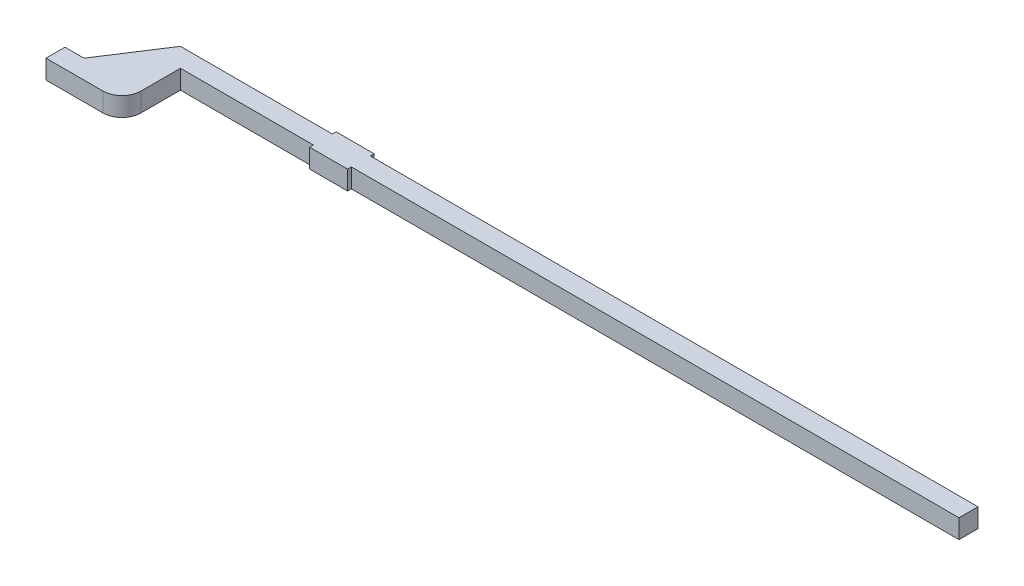
ISO-10303-21;
HEADER;
FILE_DESCRIPTION(('STEP AP214'),'2;1');
FILE_NAME('part.step','',(''),(''),'','','');
FILE_SCHEMA(('AUTOMOTIVE_DESIGN { 1 0 10303 214 1 1 1 1 }'));
ENDSEC;
DATA;
#1=APPLICATION_CONTEXT('core data for automotive mechanical design processes');
#2=APPLICATION_PROTOCOL_DEFINITION('international standard','automotive_design',2000,#1);
#3=PRODUCT_CONTEXT('',#1,'mechanical');
#4=PRODUCT('Part','Part','',(#3));
#5=PRODUCT_RELATED_PRODUCT_CATEGORY('part','',(#4));
#6=PRODUCT_DEFINITION_FORMATION('','',#4);
#7=PRODUCT_DEFINITION_CONTEXT('part definition',#1,'design');
#8=PRODUCT_DEFINITION('design','',#6,#7);
#9=PRODUCT_DEFINITION_SHAPE('','',#8);
#10=(LENGTH_UNIT() NAMED_UNIT(*) SI_UNIT(.MILLI.,.METRE.));
#11=(NAMED_UNIT(*) PLANE_ANGLE_UNIT() SI_UNIT($,.RADIAN.));
#12=(NAMED_UNIT(*) SI_UNIT($,.STERADIAN.) SOLID_ANGLE_UNIT());
#13=UNCERTAINTY_MEASURE_WITH_UNIT(LENGTH_MEASURE(1.E-05),#10,'distance_accuracy_value','');
#14=(GEOMETRIC_REPRESENTATION_CONTEXT(3) GLOBAL_UNCERTAINTY_ASSIGNED_CONTEXT((#13)) GLOBAL_UNIT_ASSIGNED_CONTEXT((#10,
#11,#12)) REPRESENTATION_CONTEXT('',''));
#15=CARTESIAN_POINT('',(0.,0.,0.));
#16=DIRECTION('',(0.,0.,1.));
#17=DIRECTION('',(1.,0.,0.));
#18=AXIS2_PLACEMENT_3D('',#15,#16,#17);
#19=CARTESIAN_POINT('',(0.,0.,0.));
#20=DIRECTION('',(0.,1.,0.));
#21=DIRECTION('',(1.,0.,0.));
#22=AXIS2_PLACEMENT_3D('',#19,#20,#21);
#23=PLANE('',#22);
#24=DIRECTION('',(-1.,0.,0.));
#25=VECTOR('',#24,1.);
#26=CARTESIAN_POINT('',(22.5,0.,-2.04));
#27=LINE('',#26,#25);
#28=CARTESIAN_POINT('',(22.5,0.,-2.04));
#29=VERTEX_POINT('',#28);
#30=CARTESIAN_POINT('',(6.5,0.,-2.04));
#31=VERTEX_POINT('',#30);
#32=EDGE_CURVE('E173',#29,#31,#27,.T.);
#33=ORIENTED_EDGE('',*,*,#32,.F.);
#34=DIRECTION('',(0.,0.,-1.));
#35=VECTOR('',#34,1.);
#36=CARTESIAN_POINT('',(22.5,0.,-1.54));
#37=LINE('',#36,#35);
#38=CARTESIAN_POINT('',(22.5,0.,-1.54));
#39=VERTEX_POINT('',#38);
#40=EDGE_CURVE('E159',#39,#29,#37,.T.);
#41=ORIENTED_EDGE('',*,*,#40,.F.);
#42=DIRECTION('',(1.,0.,0.));
#43=VECTOR('',#42,1.);
#44=CARTESIAN_POINT('',(6.5,0.,-1.54));
#45=LINE('',#44,#43);
#46=CARTESIAN_POINT('',(6.5,0.,-1.54));
#47=VERTEX_POINT('',#46);
#48=EDGE_CURVE('E171',#47,#39,#45,.T.);
#49=ORIENTED_EDGE('',*,*,#48,.F.);
#50=DIRECTION('',(0.,0.,-1.));
#51=VECTOR('',#50,1.);
#52=CARTESIAN_POINT('',(6.5,0.,-1.44));
#53=LINE('',#52,#51);
#54=CARTESIAN_POINT('',(6.5,0.,-1.44));
#55=VERTEX_POINT('',#54);
#56=EDGE_CURVE('E264',#55,#47,#53,.T.);
#57=ORIENTED_EDGE('',*,*,#56,.F.);
#58=DIRECTION('',(1.,0.,0.));
#59=VECTOR('',#58,1.);
#60=CARTESIAN_POINT('',(5.5,0.,-1.44));
#61=LINE('',#60,#59);
#62=CARTESIAN_POINT('',(5.5,0.,-1.44));
#63=VERTEX_POINT('',#62);
#64=EDGE_CURVE('E252',#63,#55,#61,.T.);
#65=ORIENTED_EDGE('',*,*,#64,.F.);
#66=DIRECTION('',(0.,0.,1.));
#67=VECTOR('',#66,1.);
#68=CARTESIAN_POINT('',(5.5,0.,-1.54));
#69=LINE('',#68,#67);
#70=CARTESIAN_POINT('',(5.5,0.,-1.54));
#71=VERTEX_POINT('',#70);
#72=EDGE_CURVE('E194',#71,#63,#69,.T.);
#73=ORIENTED_EDGE('',*,*,#72,.F.);
#74=DIRECTION('',(1.,0.,0.));
#75=VECTOR('',#74,1.);
#76=CARTESIAN_POINT('',(2.,0.,-1.54));
#77=LINE('',#76,#75);
#78=CARTESIAN_POINT('',(2.,0.,-1.54));
#79=VERTEX_POINT('',#78);
#80=EDGE_CURVE('E132',#79,#71,#77,.T.);
#81=ORIENTED_EDGE('',*,*,#80,.F.);
#82=DIRECTION('',(0.,0.,-1.));
#83=VECTOR('',#82,1.);
#84=CARTESIAN_POINT('',(2.,0.,-0.5));
#85=LINE('',#84,#83);
#86=CARTESIAN_POINT('',(2.,0.,-0.5));
#87=VERTEX_POINT('',#86);
#88=EDGE_CURVE('E129',#87,#79,#85,.T.);
#89=ORIENTED_EDGE('',*,*,#88,.F.);
#90=CARTESIAN_POINT('',(1.5,0.,-0.5));
#91=DIRECTION('',(0.,1.,0.));
#92=DIRECTION('',(0.,0.,1.));
#93=AXIS2_PLACEMENT_3D('',#90,#91,#92);
#94=CIRCLE('',#93,0.5);
#95=CARTESIAN_POINT('',(1.5,0.,0.));
#96=VERTEX_POINT('',#95);
#97=EDGE_CURVE('E115',#96,#87,#94,.T.);
#98=ORIENTED_EDGE('',*,*,#97,.F.);
#99=DIRECTION('',(1.,0.,0.));
#100=VECTOR('',#99,1.);
#101=CARTESIAN_POINT('',(0.,0.,0.));
#102=LINE('',#101,#100);
#103=CARTESIAN_POINT('',(0.,0.,0.));
#104=VERTEX_POINT('',#103);
#105=EDGE_CURVE('E221',#104,#96,#102,.T.);
#106=ORIENTED_EDGE('',*,*,#105,.F.);
#107=DIRECTION('',(0.,0.,1.));
#108=VECTOR('',#107,1.);
#109=CARTESIAN_POINT('',(0.,0.,-0.5));
#110=LINE('',#109,#108);
#111=CARTESIAN_POINT('',(0.,0.,-0.5));
#112=VERTEX_POINT('',#111);
#113=EDGE_CURVE('E214',#112,#104,#110,.T.);
#114=ORIENTED_EDGE('',*,*,#113,.F.);
#115=DIRECTION('',(-1.,0.,0.));
#116=VECTOR('',#115,1.);
#117=CARTESIAN_POINT('',(0.5,0.,-0.5));
#118=LINE('',#117,#116);
#119=CARTESIAN_POINT('',(0.5,0.,-0.5));
#120=VERTEX_POINT('',#119);
#121=EDGE_CURVE('E213',#120,#112,#118,.T.);
#122=ORIENTED_EDGE('',*,*,#121,.F.);
#123=DIRECTION('',(-0.544605442853032,0.,0.83869238199405));
#124=VECTOR('',#123,1.);
#125=CARTESIAN_POINT('',(1.5,0.,-2.04));
#126=LINE('',#125,#124);
#127=CARTESIAN_POINT('',(1.5,0.,-2.04));
#128=VERTEX_POINT('',#127);
#129=EDGE_CURVE('E315',#128,#120,#126,.T.);
#130=ORIENTED_EDGE('',*,*,#129,.F.);
#131=DIRECTION('',(-1.,0.,0.));
#132=VECTOR('',#131,1.);
#133=CARTESIAN_POINT('',(5.5,0.,-2.04));
#134=LINE('',#133,#132);
#135=CARTESIAN_POINT('',(5.5,0.,-2.04));
#136=VERTEX_POINT('',#135);
#137=EDGE_CURVE('E200',#136,#128,#134,.T.);
#138=ORIENTED_EDGE('',*,*,#137,.F.);
#139=DIRECTION('',(0.,0.,1.));
#140=VECTOR('',#139,1.);
#141=CARTESIAN_POINT('',(5.5,0.,-2.14));
#142=LINE('',#141,#140);
#143=CARTESIAN_POINT('',(5.5,0.,-2.14));
#144=VERTEX_POINT('',#143);
#145=EDGE_CURVE('E27',#144,#136,#142,.T.);
#146=ORIENTED_EDGE('',*,*,#145,.F.);
#147=DIRECTION('',(-1.,0.,0.));
#148=VECTOR('',#147,1.);
#149=CARTESIAN_POINT('',(6.5,0.,-2.14));
#150=LINE('',#149,#148);
#151=CARTESIAN_POINT('',(6.5,0.,-2.14));
#152=VERTEX_POINT('',#151);
#153=EDGE_CURVE('E11',#152,#144,#150,.T.);
#154=ORIENTED_EDGE('',*,*,#153,.F.);
#155=DIRECTION('',(0.,0.,-1.));
#156=VECTOR('',#155,1.);
#157=CARTESIAN_POINT('',(6.5,0.,0.));
#158=LINE('',#157,#156);
#159=EDGE_CURVE('E287',#31,#152,#158,.T.);
#160=ORIENTED_EDGE('',*,*,#159,.F.);
#161=EDGE_LOOP('',(#33,#41,#49,#57,#65,#73,#81,#89,#98,#106,#114,#122,#130,#138,#146,#154,#160));
#162=FACE_BOUND('',#161,.T.);
#163=ADVANCED_FACE('F16',(#162),#23,.F.);
#164=CARTESIAN_POINT('',(6.5,0.,-2.14));
#165=DIRECTION('',(0.,0.,-1.));
#166=DIRECTION('',(0.,-1.,0.));
#167=AXIS2_PLACEMENT_3D('',#164,#165,#166);
#168=PLANE('',#167);
#169=DIRECTION('',(-1.,0.,0.));
#170=VECTOR('',#169,1.);
#171=CARTESIAN_POINT('',(0.,0.5,-2.14));
#172=LINE('',#171,#170);
#173=CARTESIAN_POINT('',(6.5,0.5,-2.14));
#174=VERTEX_POINT('',#173);
#175=CARTESIAN_POINT('',(5.5,0.5,-2.14));
#176=VERTEX_POINT('',#175);
#177=EDGE_CURVE('E219',#174,#176,#172,.T.);
#178=ORIENTED_EDGE('',*,*,#177,.F.);
#179=DIRECTION('',(0.,1.,0.));
#180=VECTOR('',#179,1.);
#181=CARTESIAN_POINT('',(6.5,0.,-2.14));
#182=LINE('',#181,#180);
#183=EDGE_CURVE('E188',#152,#174,#182,.T.);
#184=ORIENTED_EDGE('',*,*,#183,.F.);
#185=ORIENTED_EDGE('',*,*,#153,.T.);
#186=DIRECTION('',(0.,-1.,0.));
#187=VECTOR('',#186,1.);
#188=CARTESIAN_POINT('',(5.5,0.,-2.14));
#189=LINE('',#188,#187);
#190=EDGE_CURVE('E196',#176,#144,#189,.T.);
#191=ORIENTED_EDGE('',*,*,#190,.F.);
#192=EDGE_LOOP('',(#178,#184,#185,#191));
#193=FACE_BOUND('',#192,.T.);
#194=ADVANCED_FACE('F527',(#193),#168,.T.);
#195=CARTESIAN_POINT('',(5.5,0.,-2.14));
#196=DIRECTION('',(-1.,0.,0.));
#197=DIRECTION('',(0.,0.,1.));
#198=AXIS2_PLACEMENT_3D('',#195,#196,#197);
#199=PLANE('',#198);
#200=DIRECTION('',(0.,0.,1.));
#201=VECTOR('',#200,1.);
#202=CARTESIAN_POINT('',(5.5,0.5,0.));
#203=LINE('',#202,#201);
#204=CARTESIAN_POINT('',(5.5,0.5,-2.04));
#205=VERTEX_POINT('',#204);
#206=EDGE_CURVE('E273',#176,#205,#203,.T.);
#207=ORIENTED_EDGE('',*,*,#206,.F.);
#208=ORIENTED_EDGE('',*,*,#190,.T.);
#209=ORIENTED_EDGE('',*,*,#145,.T.);
#210=DIRECTION('',(0.,-1.,0.));
#211=VECTOR('',#210,1.);
#212=CARTESIAN_POINT('',(5.5,0.,-2.04));
#213=LINE('',#212,#211);
#214=EDGE_CURVE('E256',#205,#136,#213,.T.);
#215=ORIENTED_EDGE('',*,*,#214,.F.);
#216=EDGE_LOOP('',(#207,#208,#209,#215));
#217=FACE_BOUND('',#216,.T.);
#218=ADVANCED_FACE('F518',(#217),#199,.T.);
#219=CARTESIAN_POINT('',(5.5,0.,-2.04));
#220=DIRECTION('',(0.,0.,-1.));
#221=DIRECTION('',(0.,-1.,0.));
#222=AXIS2_PLACEMENT_3D('',#219,#220,#221);
#223=PLANE('',#222);
#224=DIRECTION('',(-1.,0.,0.));
#225=VECTOR('',#224,1.);
#226=CARTESIAN_POINT('',(0.,0.5,-2.04));
#227=LINE('',#226,#225);
#228=CARTESIAN_POINT('',(1.5,0.5,-2.04));
#229=VERTEX_POINT('',#228);
#230=EDGE_CURVE('E320',#205,#229,#227,.T.);
#231=ORIENTED_EDGE('',*,*,#230,.F.);
#232=ORIENTED_EDGE('',*,*,#214,.T.);
#233=ORIENTED_EDGE('',*,*,#137,.T.);
#234=DIRECTION('',(0.,-1.,0.));
#235=VECTOR('',#234,1.);
#236=CARTESIAN_POINT('',(1.5,0.,-2.04));
#237=LINE('',#236,#235);
#238=EDGE_CURVE('E328',#229,#128,#237,.T.);
#239=ORIENTED_EDGE('',*,*,#238,.F.);
#240=EDGE_LOOP('',(#231,#232,#233,#239));
#241=FACE_BOUND('',#240,.T.);
#242=ADVANCED_FACE('F353',(#241),#223,.T.);
#243=CARTESIAN_POINT('',(1.5,0.,-2.04));
#244=DIRECTION('',(-0.83869238199405,0.,-0.544605442853032));
#245=DIRECTION('',(-0.544605442853032,0.,0.83869238199405));
#246=AXIS2_PLACEMENT_3D('',#243,#244,#245);
#247=PLANE('',#246);
#248=DIRECTION('',(-0.544605442853032,0.,0.83869238199405));
#249=VECTOR('',#248,1.);
#250=CARTESIAN_POINT('',(1.5,0.5,-2.04));
#251=LINE('',#250,#249);
#252=CARTESIAN_POINT('',(0.5,0.5,-0.5));
#253=VERTEX_POINT('',#252);
#254=EDGE_CURVE('E316',#229,#253,#251,.T.);
#255=ORIENTED_EDGE('',*,*,#254,.F.);
#256=ORIENTED_EDGE('',*,*,#238,.T.);
#257=ORIENTED_EDGE('',*,*,#129,.T.);
#258=DIRECTION('',(0.,-1.,0.));
#259=VECTOR('',#258,1.);
#260=CARTESIAN_POINT('',(0.5,0.,-0.5));
#261=LINE('',#260,#259);
#262=EDGE_CURVE('E209',#253,#120,#261,.T.);
#263=ORIENTED_EDGE('',*,*,#262,.F.);
#264=EDGE_LOOP('',(#255,#256,#257,#263));
#265=FACE_BOUND('',#264,.T.);
#266=ADVANCED_FACE('F360',(#265),#247,.T.);
#267=CARTESIAN_POINT('',(0.5,0.,-0.5));
#268=DIRECTION('',(0.,0.,-1.));
#269=DIRECTION('',(0.,-1.,0.));
#270=AXIS2_PLACEMENT_3D('',#267,#268,#269);
#271=PLANE('',#270);
#272=DIRECTION('',(-1.,0.,0.));
#273=VECTOR('',#272,1.);
#274=CARTESIAN_POINT('',(0.,0.5,-0.5));
#275=LINE('',#274,#273);
#276=CARTESIAN_POINT('',(0.,0.5,-0.5));
#277=VERTEX_POINT('',#276);
#278=EDGE_CURVE('E206',#253,#277,#275,.T.);
#279=ORIENTED_EDGE('',*,*,#278,.F.);
#280=ORIENTED_EDGE('',*,*,#262,.T.);
#281=ORIENTED_EDGE('',*,*,#121,.T.);
#282=DIRECTION('',(0.,-1.,0.));
#283=VECTOR('',#282,1.);
#284=CARTESIAN_POINT('',(0.,0.,-0.5));
#285=LINE('',#284,#283);
#286=EDGE_CURVE('E223',#277,#112,#285,.T.);
#287=ORIENTED_EDGE('',*,*,#286,.F.);
#288=EDGE_LOOP('',(#279,#280,#281,#287));
#289=FACE_BOUND('',#288,.T.);
#290=ADVANCED_FACE('F18',(#289),#271,.T.);
#291=CARTESIAN_POINT('',(0.,0.,-0.5));
#292=DIRECTION('',(-1.,0.,0.));
#293=DIRECTION('',(0.,0.,1.));
#294=AXIS2_PLACEMENT_3D('',#291,#292,#293);
#295=PLANE('',#294);
#296=DIRECTION('',(0.,0.,1.));
#297=VECTOR('',#296,1.);
#298=CARTESIAN_POINT('',(0.,0.5,0.));
#299=LINE('',#298,#297);
#300=CARTESIAN_POINT('',(0.,0.5,0.));
#301=VERTEX_POINT('',#300);
#302=EDGE_CURVE('E201',#277,#301,#299,.T.);
#303=ORIENTED_EDGE('',*,*,#302,.F.);
#304=ORIENTED_EDGE('',*,*,#286,.T.);
#305=ORIENTED_EDGE('',*,*,#113,.T.);
#306=DIRECTION('',(0.,-1.,0.));
#307=VECTOR('',#306,1.);
#308=CARTESIAN_POINT('',(0.,0.,0.));
#309=LINE('',#308,#307);
#310=EDGE_CURVE('E126',#301,#104,#309,.T.);
#311=ORIENTED_EDGE('',*,*,#310,.F.);
#312=EDGE_LOOP('',(#303,#304,#305,#311));
#313=FACE_BOUND('',#312,.T.);
#314=ADVANCED_FACE('F484',(#313),#295,.T.);
#315=CARTESIAN_POINT('',(0.,0.,0.));
#316=DIRECTION('',(0.,0.,1.));
#317=DIRECTION('',(1.,0.,0.));
#318=AXIS2_PLACEMENT_3D('',#315,#316,#317);
#319=PLANE('',#318);
#320=DIRECTION('',(1.,0.,0.));
#321=VECTOR('',#320,1.);
#322=CARTESIAN_POINT('',(0.,0.5,0.));
#323=LINE('',#322,#321);
#324=CARTESIAN_POINT('',(1.5,0.5,0.));
#325=VERTEX_POINT('',#324);
#326=EDGE_CURVE('E205',#301,#325,#323,.T.);
#327=ORIENTED_EDGE('',*,*,#326,.F.);
#328=ORIENTED_EDGE('',*,*,#310,.T.);
#329=ORIENTED_EDGE('',*,*,#105,.T.);
#330=DIRECTION('',(0.,-1.,0.));
#331=VECTOR('',#330,1.);
#332=CARTESIAN_POINT('',(1.5,0.,0.));
#333=LINE('',#332,#331);
#334=EDGE_CURVE('E122',#325,#96,#333,.T.);
#335=ORIENTED_EDGE('',*,*,#334,.F.);
#336=EDGE_LOOP('',(#327,#328,#329,#335));
#337=FACE_BOUND('',#336,.T.);
#338=ADVANCED_FACE('F479',(#337),#319,.T.);
#339=CARTESIAN_POINT('',(1.5,0.,-0.5));
#340=DIRECTION('',(0.,1.,0.));
#341=DIRECTION('',(0.,0.,1.));
#342=AXIS2_PLACEMENT_3D('',#339,#340,#341);
#343=CYLINDRICAL_SURFACE('',#342,0.5);
#344=CARTESIAN_POINT('',(1.5,0.5,-0.5));
#345=DIRECTION('',(0.,1.,0.));
#346=DIRECTION('',(0.,0.,1.));
#347=AXIS2_PLACEMENT_3D('',#344,#345,#346);
#348=CIRCLE('',#347,0.5);
#349=CARTESIAN_POINT('',(2.,0.5,-0.5));
#350=VERTEX_POINT('',#349);
#351=EDGE_CURVE('E191',#325,#350,#348,.T.);
#352=ORIENTED_EDGE('',*,*,#351,.F.);
#353=ORIENTED_EDGE('',*,*,#334,.T.);
#354=ORIENTED_EDGE('',*,*,#97,.T.);
#355=DIRECTION('',(0.,-1.,0.));
#356=VECTOR('',#355,1.);
#357=CARTESIAN_POINT('',(2.,0.,-0.5));
#358=LINE('',#357,#356);
#359=EDGE_CURVE('E120',#350,#87,#358,.T.);
#360=ORIENTED_EDGE('',*,*,#359,.F.);
#361=EDGE_LOOP('',(#352,#353,#354,#360));
#362=FACE_BOUND('',#361,.T.);
#363=ADVANCED_FACE('F118',(#362),#343,.T.);
#364=CARTESIAN_POINT('',(2.,0.,-0.5));
#365=DIRECTION('',(1.,0.,0.));
#366=DIRECTION('',(0.,1.,0.));
#367=AXIS2_PLACEMENT_3D('',#364,#365,#366);
#368=PLANE('',#367);
#369=DIRECTION('',(0.,0.,-1.));
#370=VECTOR('',#369,1.);
#371=CARTESIAN_POINT('',(2.,0.5,0.));
#372=LINE('',#371,#370);
#373=CARTESIAN_POINT('',(2.,0.5,-1.54));
#374=VERTEX_POINT('',#373);
#375=EDGE_CURVE('E140',#350,#374,#372,.T.);
#376=ORIENTED_EDGE('',*,*,#375,.F.);
#377=ORIENTED_EDGE('',*,*,#359,.T.);
#378=ORIENTED_EDGE('',*,*,#88,.T.);
#379=DIRECTION('',(0.,-1.,0.));
#380=VECTOR('',#379,1.);
#381=CARTESIAN_POINT('',(2.,0.,-1.54));
#382=LINE('',#381,#380);
#383=EDGE_CURVE('E148',#374,#79,#382,.T.);
#384=ORIENTED_EDGE('',*,*,#383,.F.);
#385=EDGE_LOOP('',(#376,#377,#378,#384));
#386=FACE_BOUND('',#385,.T.);
#387=ADVANCED_FACE('F138',(#386),#368,.T.);
#388=CARTESIAN_POINT('',(2.,0.,-1.54));
#389=DIRECTION('',(0.,0.,1.));
#390=DIRECTION('',(1.,0.,0.));
#391=AXIS2_PLACEMENT_3D('',#388,#389,#390);
#392=PLANE('',#391);
#393=DIRECTION('',(1.,0.,0.));
#394=VECTOR('',#393,1.);
#395=CARTESIAN_POINT('',(0.,0.5,-1.54));
#396=LINE('',#395,#394);
#397=CARTESIAN_POINT('',(5.5,0.5,-1.54));
#398=VERTEX_POINT('',#397);
#399=EDGE_CURVE('E240',#374,#398,#396,.T.);
#400=ORIENTED_EDGE('',*,*,#399,.F.);
#401=ORIENTED_EDGE('',*,*,#383,.T.);
#402=ORIENTED_EDGE('',*,*,#80,.T.);
#403=DIRECTION('',(0.,-1.,0.));
#404=VECTOR('',#403,1.);
#405=CARTESIAN_POINT('',(5.5,0.,-1.54));
#406=LINE('',#405,#404);
#407=EDGE_CURVE('E248',#398,#71,#406,.T.);
#408=ORIENTED_EDGE('',*,*,#407,.F.);
#409=EDGE_LOOP('',(#400,#401,#402,#408));
#410=FACE_BOUND('',#409,.T.);
#411=ADVANCED_FACE('F473',(#410),#392,.T.);
#412=CARTESIAN_POINT('',(5.5,0.,-1.54));
#413=DIRECTION('',(-1.,0.,0.));
#414=DIRECTION('',(0.,0.,1.));
#415=AXIS2_PLACEMENT_3D('',#412,#413,#414);
#416=PLANE('',#415);
#417=DIRECTION('',(0.,0.,1.));
#418=VECTOR('',#417,1.);
#419=CARTESIAN_POINT('',(5.5,0.5,0.));
#420=LINE('',#419,#418);
#421=CARTESIAN_POINT('',(5.5,0.5,-1.44));
#422=VERTEX_POINT('',#421);
#423=EDGE_CURVE('E243',#398,#422,#420,.T.);
#424=ORIENTED_EDGE('',*,*,#423,.F.);
#425=ORIENTED_EDGE('',*,*,#407,.T.);
#426=ORIENTED_EDGE('',*,*,#72,.T.);
#427=DIRECTION('',(0.,-1.,0.));
#428=VECTOR('',#427,1.);
#429=CARTESIAN_POINT('',(5.5,0.,-1.44));
#430=LINE('',#429,#428);
#431=EDGE_CURVE('E268',#422,#63,#430,.T.);
#432=ORIENTED_EDGE('',*,*,#431,.F.);
#433=EDGE_LOOP('',(#424,#425,#426,#432));
#434=FACE_BOUND('',#433,.T.);
#435=ADVANCED_FACE('F382',(#434),#416,.T.);
#436=CARTESIAN_POINT('',(5.5,0.,-1.44));
#437=DIRECTION('',(0.,0.,1.));
#438=DIRECTION('',(1.,0.,0.));
#439=AXIS2_PLACEMENT_3D('',#436,#437,#438);
#440=PLANE('',#439);
#441=DIRECTION('',(1.,0.,0.));
#442=VECTOR('',#441,1.);
#443=CARTESIAN_POINT('',(0.,0.5,-1.44));
#444=LINE('',#443,#442);
#445=CARTESIAN_POINT('',(6.5,0.5,-1.44));
#446=VERTEX_POINT('',#445);
#447=EDGE_CURVE('E20',#422,#446,#444,.T.);
#448=ORIENTED_EDGE('',*,*,#447,.F.);
#449=ORIENTED_EDGE('',*,*,#431,.T.);
#450=ORIENTED_EDGE('',*,*,#64,.T.);
#451=DIRECTION('',(0.,-1.,0.));
#452=VECTOR('',#451,1.);
#453=CARTESIAN_POINT('',(6.5,0.,-1.44));
#454=LINE('',#453,#452);
#455=EDGE_CURVE('E260',#446,#55,#454,.T.);
#456=ORIENTED_EDGE('',*,*,#455,.F.);
#457=EDGE_LOOP('',(#448,#449,#450,#456));
#458=FACE_BOUND('',#457,.T.);
#459=ADVANCED_FACE('F389',(#458),#440,.T.);
#460=CARTESIAN_POINT('',(6.5,0.,-1.44));
#461=DIRECTION('',(1.,0.,0.));
#462=DIRECTION('',(0.,1.,0.));
#463=AXIS2_PLACEMENT_3D('',#460,#461,#462);
#464=PLANE('',#463);
#465=DIRECTION('',(0.,0.,-1.));
#466=VECTOR('',#465,1.);
#467=CARTESIAN_POINT('',(6.5,0.5,0.));
#468=LINE('',#467,#466);
#469=CARTESIAN_POINT('',(6.5,0.5,-1.54));
#470=VERTEX_POINT('',#469);
#471=EDGE_CURVE('E302',#446,#470,#468,.T.);
#472=ORIENTED_EDGE('',*,*,#471,.F.);
#473=ORIENTED_EDGE('',*,*,#455,.T.);
#474=ORIENTED_EDGE('',*,*,#56,.T.);
#475=DIRECTION('',(0.,-1.,0.));
#476=VECTOR('',#475,1.);
#477=CARTESIAN_POINT('',(6.5,0.,-1.54));
#478=LINE('',#477,#476);
#479=EDGE_CURVE('E161',#470,#47,#478,.T.);
#480=ORIENTED_EDGE('',*,*,#479,.F.);
#481=EDGE_LOOP('',(#472,#473,#474,#480));
#482=FACE_BOUND('',#481,.T.);
#483=ADVANCED_FACE('F543',(#482),#464,.T.);
#484=CARTESIAN_POINT('',(6.5,0.,-1.54));
#485=DIRECTION('',(0.,0.,1.));
#486=DIRECTION('',(1.,0.,0.));
#487=AXIS2_PLACEMENT_3D('',#484,#485,#486);
#488=PLANE('',#487);
#489=DIRECTION('',(1.,0.,0.));
#490=VECTOR('',#489,1.);
#491=CARTESIAN_POINT('',(0.,0.5,-1.54));
#492=LINE('',#491,#490);
#493=CARTESIAN_POINT('',(22.5,0.5,-1.54));
#494=VERTEX_POINT('',#493);
#495=EDGE_CURVE('E158',#470,#494,#492,.T.);
#496=ORIENTED_EDGE('',*,*,#495,.F.);
#497=ORIENTED_EDGE('',*,*,#479,.T.);
#498=ORIENTED_EDGE('',*,*,#48,.T.);
#499=DIRECTION('',(0.,-1.,0.));
#500=VECTOR('',#499,1.);
#501=CARTESIAN_POINT('',(22.5,0.,-1.54));
#502=LINE('',#501,#500);
#503=EDGE_CURVE('E152',#494,#39,#502,.T.);
#504=ORIENTED_EDGE('',*,*,#503,.F.);
#505=EDGE_LOOP('',(#496,#497,#498,#504));
#506=FACE_BOUND('',#505,.T.);
#507=ADVANCED_FACE('F281',(#506),#488,.T.);
#508=CARTESIAN_POINT('',(22.5,0.,-1.54));
#509=DIRECTION('',(1.,0.,0.));
#510=DIRECTION('',(0.,1.,0.));
#511=AXIS2_PLACEMENT_3D('',#508,#509,#510);
#512=PLANE('',#511);
#513=DIRECTION('',(0.,0.,-1.));
#514=VECTOR('',#513,1.);
#515=CARTESIAN_POINT('',(22.5,0.5,0.));
#516=LINE('',#515,#514);
#517=CARTESIAN_POINT('',(22.5,0.5,-2.04));
#518=VERTEX_POINT('',#517);
#519=EDGE_CURVE('E154',#494,#518,#516,.T.);
#520=ORIENTED_EDGE('',*,*,#519,.F.);
#521=ORIENTED_EDGE('',*,*,#503,.T.);
#522=ORIENTED_EDGE('',*,*,#40,.T.);
#523=DIRECTION('',(0.,-1.,0.));
#524=VECTOR('',#523,1.);
#525=CARTESIAN_POINT('',(22.5,0.,-2.04));
#526=LINE('',#525,#524);
#527=EDGE_CURVE('E179',#518,#29,#526,.T.);
#528=ORIENTED_EDGE('',*,*,#527,.F.);
#529=EDGE_LOOP('',(#520,#521,#522,#528));
#530=FACE_BOUND('',#529,.T.);
#531=ADVANCED_FACE('F293',(#530),#512,.T.);
#532=CARTESIAN_POINT('',(22.5,0.,-2.04));
#533=DIRECTION('',(0.,0.,-1.));
#534=DIRECTION('',(0.,-1.,0.));
#535=AXIS2_PLACEMENT_3D('',#532,#533,#534);
#536=PLANE('',#535);
#537=DIRECTION('',(-1.,0.,0.));
#538=VECTOR('',#537,1.);
#539=CARTESIAN_POINT('',(0.,0.5,-2.04));
#540=LINE('',#539,#538);
#541=CARTESIAN_POINT('',(6.5,0.5,-2.04));
#542=VERTEX_POINT('',#541);
#543=EDGE_CURVE('E220',#518,#542,#540,.T.);
#544=ORIENTED_EDGE('',*,*,#543,.F.);
#545=ORIENTED_EDGE('',*,*,#527,.T.);
#546=ORIENTED_EDGE('',*,*,#32,.T.);
#547=DIRECTION('',(0.,-1.,0.));
#548=VECTOR('',#547,1.);
#549=CARTESIAN_POINT('',(6.5,0.,-2.04));
#550=LINE('',#549,#548);
#551=EDGE_CURVE('E157',#542,#31,#550,.T.);
#552=ORIENTED_EDGE('',*,*,#551,.F.);
#553=EDGE_LOOP('',(#544,#545,#546,#552));
#554=FACE_BOUND('',#553,.T.);
#555=ADVANCED_FACE('F290',(#554),#536,.T.);
#556=CARTESIAN_POINT('',(6.5,0.,-2.04));
#557=DIRECTION('',(1.,0.,0.));
#558=DIRECTION('',(0.,1.,0.));
#559=AXIS2_PLACEMENT_3D('',#556,#557,#558);
#560=PLANE('',#559);
#561=DIRECTION('',(0.,0.,-1.));
#562=VECTOR('',#561,1.);
#563=CARTESIAN_POINT('',(6.5,0.5,0.));
#564=LINE('',#563,#562);
#565=EDGE_CURVE('E215',#542,#174,#564,.T.);
#566=ORIENTED_EDGE('',*,*,#565,.F.);
#567=ORIENTED_EDGE('',*,*,#551,.T.);
#568=ORIENTED_EDGE('',*,*,#159,.T.);
#569=ORIENTED_EDGE('',*,*,#183,.T.);
#570=EDGE_LOOP('',(#566,#567,#568,#569));
#571=FACE_BOUND('',#570,.T.);
#572=ADVANCED_FACE('F535',(#571),#560,.T.);
#573=CARTESIAN_POINT('',(0.,0.5,0.));
#574=DIRECTION('',(0.,1.,0.));
#575=DIRECTION('',(1.,0.,0.));
#576=AXIS2_PLACEMENT_3D('',#573,#574,#575);
#577=PLANE('',#576);
#578=ORIENTED_EDGE('',*,*,#543,.T.);
#579=ORIENTED_EDGE('',*,*,#565,.T.);
#580=ORIENTED_EDGE('',*,*,#177,.T.);
#581=ORIENTED_EDGE('',*,*,#206,.T.);
#582=ORIENTED_EDGE('',*,*,#230,.T.);
#583=ORIENTED_EDGE('',*,*,#254,.T.);
#584=ORIENTED_EDGE('',*,*,#278,.T.);
#585=ORIENTED_EDGE('',*,*,#302,.T.);
#586=ORIENTED_EDGE('',*,*,#326,.T.);
#587=ORIENTED_EDGE('',*,*,#351,.T.);
#588=ORIENTED_EDGE('',*,*,#375,.T.);
#589=ORIENTED_EDGE('',*,*,#399,.T.);
#590=ORIENTED_EDGE('',*,*,#423,.T.);
#591=ORIENTED_EDGE('',*,*,#447,.T.);
#592=ORIENTED_EDGE('',*,*,#471,.T.);
#593=ORIENTED_EDGE('',*,*,#495,.T.);
#594=ORIENTED_EDGE('',*,*,#519,.T.);
#595=EDGE_LOOP('',(#578,#579,#580,#581,#582,#583,#584,#585,#586,#587,#588,#589,#590,#591,#592,
#593,#594));
#596=FACE_BOUND('',#595,.T.);
#597=ADVANCED_FACE('F298',(#596),#577,.T.);
#598=CLOSED_SHELL('',(#163,#194,#218,#242,#266,#290,#314,#338,#363,#387,#411,#435,#459,#483,
#507,#531,#555,#572,#597));
#599=MANIFOLD_SOLID_BREP('B1',#598);
#600=ADVANCED_BREP_SHAPE_REPRESENTATION('',(#18,#599),#14);
#601=SHAPE_DEFINITION_REPRESENTATION(#9,#600);
ENDSEC;
END-ISO-10303-21;
